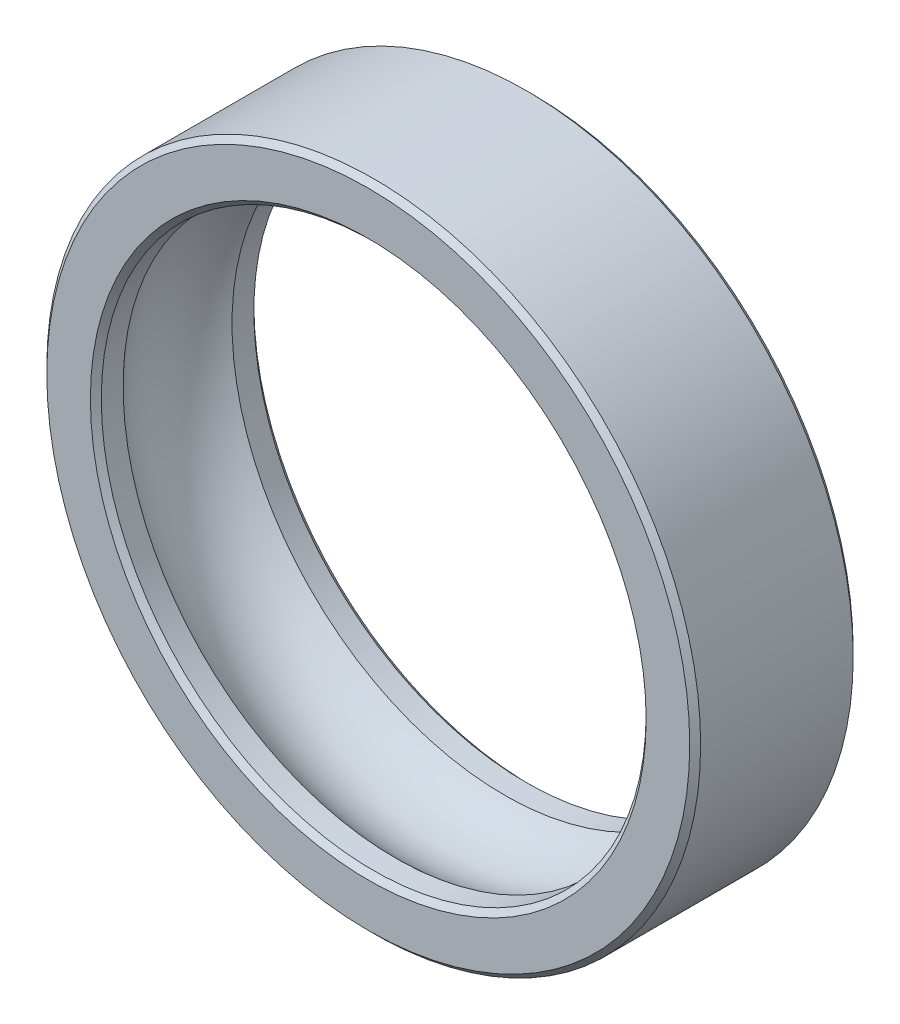
ISO-10303-21;
HEADER;
FILE_DESCRIPTION(('STEP AP214'),'2;1');
FILE_NAME('part.step','',(''),(''),'','','');
FILE_SCHEMA(('AUTOMOTIVE_DESIGN { 1 0 10303 214 1 1 1 1 }'));
ENDSEC;
DATA;
#1=APPLICATION_CONTEXT('core data for automotive mechanical design processes');
#2=APPLICATION_PROTOCOL_DEFINITION('international standard','automotive_design',2000,#1);
#3=PRODUCT_CONTEXT('',#1,'mechanical');
#4=PRODUCT('Part','Part','',(#3));
#5=PRODUCT_RELATED_PRODUCT_CATEGORY('part','',(#4));
#6=PRODUCT_DEFINITION_FORMATION('','',#4);
#7=PRODUCT_DEFINITION_CONTEXT('part definition',#1,'design');
#8=PRODUCT_DEFINITION('design','',#6,#7);
#9=PRODUCT_DEFINITION_SHAPE('','',#8);
#10=(LENGTH_UNIT() NAMED_UNIT(*) SI_UNIT(.MILLI.,.METRE.));
#11=(NAMED_UNIT(*) PLANE_ANGLE_UNIT() SI_UNIT($,.RADIAN.));
#12=(NAMED_UNIT(*) SI_UNIT($,.STERADIAN.) SOLID_ANGLE_UNIT());
#13=UNCERTAINTY_MEASURE_WITH_UNIT(LENGTH_MEASURE(1.E-05),#10,'distance_accuracy_value','');
#14=(GEOMETRIC_REPRESENTATION_CONTEXT(3) GLOBAL_UNCERTAINTY_ASSIGNED_CONTEXT((#13)) GLOBAL_UNIT_ASSIGNED_CONTEXT((#10,
#11,#12)) REPRESENTATION_CONTEXT('',''));
#15=CARTESIAN_POINT('',(0.,0.,0.));
#16=DIRECTION('',(0.,0.,1.));
#17=DIRECTION('',(1.,0.,0.));
#18=AXIS2_PLACEMENT_3D('',#15,#16,#17);
#19=CARTESIAN_POINT('',(0.,0.,0.));
#20=DIRECTION('',(0.,0.,1.));
#21=DIRECTION('',(1.,0.,0.));
#22=AXIS2_PLACEMENT_3D('',#19,#20,#21);
#23=CYLINDRICAL_SURFACE('',#22,1270.);
#24=CARTESIAN_POINT('',(0.,0.,-355.600000000001));
#25=DIRECTION('',(0.,0.,1.));
#26=DIRECTION('',(1.,0.,0.));
#27=AXIS2_PLACEMENT_3D('',#24,#25,#26);
#28=CIRCLE('',#27,1270.);
#29=CARTESIAN_POINT('',(1270.,0.,-355.600000000001));
#30=VERTEX_POINT('',#29);
#31=EDGE_CURVE('E48',#30,#30,#28,.F.);
#32=ORIENTED_EDGE('',*,*,#31,.T.);
#33=EDGE_LOOP('',(#32));
#34=FACE_BOUND('',#33,.T.);
#35=CARTESIAN_POINT('',(0.,0.,-254.));
#36=DIRECTION('',(0.,0.,1.));
#37=DIRECTION('',(1.,0.,0.));
#38=AXIS2_PLACEMENT_3D('',#35,#36,#37);
#39=CIRCLE('',#38,1270.);
#40=CARTESIAN_POINT('',(1270.,0.,-254.));
#41=VERTEX_POINT('',#40);
#42=EDGE_CURVE('E69',#41,#41,#39,.T.);
#43=ORIENTED_EDGE('',*,*,#42,.T.);
#44=EDGE_LOOP('',(#43));
#45=FACE_BOUND('',#44,.T.);
#46=ADVANCED_FACE('F37',(#34,#45),#23,.F.);
#47=CARTESIAN_POINT('',(0.,0.,0.));
#48=DIRECTION('',(0.,0.,1.));
#49=DIRECTION('',(1.,0.,0.));
#50=AXIS2_PLACEMENT_3D('',#47,#48,#49);
#51=TOROIDAL_SURFACE('',#50,1016.,359.210244842767);
#52=ORIENTED_EDGE('',*,*,#42,.F.);
#53=EDGE_LOOP('',(#52));
#54=FACE_BOUND('',#53,.T.);
#55=CARTESIAN_POINT('',(0.,0.,254.));
#56=DIRECTION('',(0.,0.,1.));
#57=DIRECTION('',(1.,0.,0.));
#58=AXIS2_PLACEMENT_3D('',#55,#56,#57);
#59=CIRCLE('',#58,1270.);
#60=CARTESIAN_POINT('',(1270.,0.,254.));
#61=VERTEX_POINT('',#60);
#62=EDGE_CURVE('E72',#61,#61,#59,.T.);
#63=ORIENTED_EDGE('',*,*,#62,.T.);
#64=EDGE_LOOP('',(#63));
#65=FACE_BOUND('',#64,.T.);
#66=ADVANCED_FACE('F76',(#54,#65),#51,.F.);
#67=CARTESIAN_POINT('',(0.,0.,0.));
#68=DIRECTION('',(0.,0.,1.));
#69=DIRECTION('',(1.,0.,0.));
#70=AXIS2_PLACEMENT_3D('',#67,#68,#69);
#71=CYLINDRICAL_SURFACE('',#70,1270.);
#72=CARTESIAN_POINT('',(0.,0.,355.6));
#73=DIRECTION('',(0.,0.,-1.));
#74=DIRECTION('',(-1.,0.,0.));
#75=AXIS2_PLACEMENT_3D('',#72,#73,#74);
#76=CIRCLE('',#75,1270.);
#77=CARTESIAN_POINT('',(-1270.,0.,355.6));
#78=VERTEX_POINT('',#77);
#79=EDGE_CURVE('E66',#78,#78,#76,.F.);
#80=ORIENTED_EDGE('',*,*,#79,.T.);
#81=EDGE_LOOP('',(#80));
#82=FACE_BOUND('',#81,.T.);
#83=ORIENTED_EDGE('',*,*,#62,.F.);
#84=EDGE_LOOP('',(#83));
#85=FACE_BOUND('',#84,.T.);
#86=ADVANCED_FACE('F78',(#82,#85),#71,.F.);
#87=CARTESIAN_POINT('',(0.,1524.,381.));
#88=DIRECTION('',(0.,0.,-1.));
#89=DIRECTION('',(-1.,0.,0.));
#90=AXIS2_PLACEMENT_3D('',#87,#88,#89);
#91=PLANE('',#90);
#92=CARTESIAN_POINT('',(0.,0.,381.));
#93=DIRECTION('',(0.,0.,-1.));
#94=DIRECTION('',(-1.,0.,0.));
#95=AXIS2_PLACEMENT_3D('',#92,#93,#94);
#96=CIRCLE('',#95,1295.4);
#97=CARTESIAN_POINT('',(-1295.4,0.,381.));
#98=VERTEX_POINT('',#97);
#99=EDGE_CURVE('E60',#98,#98,#96,.T.);
#100=ORIENTED_EDGE('',*,*,#99,.T.);
#101=EDGE_LOOP('',(#100));
#102=FACE_BOUND('',#101,.T.);
#103=CARTESIAN_POINT('',(0.,0.,381.));
#104=DIRECTION('',(0.,0.,-1.));
#105=DIRECTION('',(-1.,0.,0.));
#106=AXIS2_PLACEMENT_3D('',#103,#104,#105);
#107=CIRCLE('',#106,1498.6);
#108=CARTESIAN_POINT('',(-1498.6,0.,381.));
#109=VERTEX_POINT('',#108);
#110=EDGE_CURVE('E63',#109,#109,#107,.F.);
#111=ORIENTED_EDGE('',*,*,#110,.T.);
#112=EDGE_LOOP('',(#111));
#113=FACE_BOUND('',#112,.T.);
#114=ADVANCED_FACE('F80',(#102,#113),#91,.F.);
#115=CARTESIAN_POINT('',(0.,0.,0.));
#116=DIRECTION('',(0.,0.,1.));
#117=DIRECTION('',(1.,0.,0.));
#118=AXIS2_PLACEMENT_3D('',#115,#116,#117);
#119=CYLINDRICAL_SURFACE('',#118,1524.);
#120=CARTESIAN_POINT('',(0.,0.,355.6));
#121=DIRECTION('',(0.,0.,-1.));
#122=DIRECTION('',(-1.,0.,0.));
#123=AXIS2_PLACEMENT_3D('',#120,#121,#122);
#124=CIRCLE('',#123,1524.);
#125=CARTESIAN_POINT('',(-1524.,0.,355.6));
#126=VERTEX_POINT('',#125);
#127=EDGE_CURVE('E10',#126,#126,#124,.T.);
#128=ORIENTED_EDGE('',*,*,#127,.T.);
#129=EDGE_LOOP('',(#128));
#130=FACE_BOUND('',#129,.T.);
#131=CARTESIAN_POINT('',(0.,0.,-355.6));
#132=DIRECTION('',(0.,0.,1.));
#133=DIRECTION('',(1.,0.,0.));
#134=AXIS2_PLACEMENT_3D('',#131,#132,#133);
#135=CIRCLE('',#134,1524.);
#136=CARTESIAN_POINT('',(1524.,0.,-355.6));
#137=VERTEX_POINT('',#136);
#138=EDGE_CURVE('E44',#137,#137,#135,.T.);
#139=ORIENTED_EDGE('',*,*,#138,.T.);
#140=EDGE_LOOP('',(#139));
#141=FACE_BOUND('',#140,.T.);
#142=ADVANCED_FACE('F87',(#130,#141),#119,.T.);
#143=CARTESIAN_POINT('',(0.,1524.,-381.));
#144=DIRECTION('',(0.,0.,1.));
#145=DIRECTION('',(1.,0.,0.));
#146=AXIS2_PLACEMENT_3D('',#143,#144,#145);
#147=PLANE('',#146);
#148=CARTESIAN_POINT('',(0.,0.,-381.));
#149=DIRECTION('',(0.,0.,1.));
#150=DIRECTION('',(1.,0.,0.));
#151=AXIS2_PLACEMENT_3D('',#148,#149,#150);
#152=CIRCLE('',#151,1295.4);
#153=CARTESIAN_POINT('',(1295.4,0.,-381.));
#154=VERTEX_POINT('',#153);
#155=EDGE_CURVE('E52',#154,#154,#152,.T.);
#156=ORIENTED_EDGE('',*,*,#155,.T.);
#157=EDGE_LOOP('',(#156));
#158=FACE_BOUND('',#157,.T.);
#159=CARTESIAN_POINT('',(0.,0.,-381.));
#160=DIRECTION('',(0.,0.,1.));
#161=DIRECTION('',(1.,0.,0.));
#162=AXIS2_PLACEMENT_3D('',#159,#160,#161);
#163=CIRCLE('',#162,1498.6);
#164=CARTESIAN_POINT('',(1498.6,0.,-381.));
#165=VERTEX_POINT('',#164);
#166=EDGE_CURVE('E57',#165,#165,#163,.F.);
#167=ORIENTED_EDGE('',*,*,#166,.T.);
#168=EDGE_LOOP('',(#167));
#169=FACE_BOUND('',#168,.T.);
#170=ADVANCED_FACE('F103',(#158,#169),#147,.F.);
#171=CARTESIAN_POINT('',(0.,0.,355.6));
#172=DIRECTION('',(0.,0.,1.));
#173=DIRECTION('',(1.,0.,0.));
#174=AXIS2_PLACEMENT_3D('',#171,#172,#173);
#175=CONICAL_SURFACE('',#174,1270.,0.785398163397448);
#176=ORIENTED_EDGE('',*,*,#99,.F.);
#177=EDGE_LOOP('',(#176));
#178=FACE_BOUND('',#177,.T.);
#179=ORIENTED_EDGE('',*,*,#79,.F.);
#180=EDGE_LOOP('',(#179));
#181=FACE_BOUND('',#180,.T.);
#182=ADVANCED_FACE('F99',(#178,#181),#175,.F.);
#183=CARTESIAN_POINT('',(0.,0.,-381.));
#184=DIRECTION('',(0.,0.,-1.));
#185=DIRECTION('',(-1.,0.,0.));
#186=AXIS2_PLACEMENT_3D('',#183,#184,#185);
#187=CONICAL_SURFACE('',#186,1295.4,0.785398163397457);
#188=ORIENTED_EDGE('',*,*,#31,.F.);
#189=EDGE_LOOP('',(#188));
#190=FACE_BOUND('',#189,.T.);
#191=ORIENTED_EDGE('',*,*,#155,.F.);
#192=EDGE_LOOP('',(#191));
#193=FACE_BOUND('',#192,.T.);
#194=ADVANCED_FACE('F102',(#190,#193),#187,.F.);
#195=CARTESIAN_POINT('',(0.,0.,381.));
#196=DIRECTION('',(0.,0.,-1.));
#197=DIRECTION('',(-1.,0.,0.));
#198=AXIS2_PLACEMENT_3D('',#195,#196,#197);
#199=CONICAL_SURFACE('',#198,1498.6,0.785398163397457);
#200=ORIENTED_EDGE('',*,*,#127,.F.);
#201=EDGE_LOOP('',(#200));
#202=FACE_BOUND('',#201,.T.);
#203=ORIENTED_EDGE('',*,*,#110,.F.);
#204=EDGE_LOOP('',(#203));
#205=FACE_BOUND('',#204,.T.);
#206=ADVANCED_FACE('F106',(#202,#205),#199,.T.);
#207=CARTESIAN_POINT('',(0.,0.,-355.6));
#208=DIRECTION('',(0.,0.,1.));
#209=DIRECTION('',(1.,0.,0.));
#210=AXIS2_PLACEMENT_3D('',#207,#208,#209);
#211=CONICAL_SURFACE('',#210,1524.,0.785398163397453);
#212=ORIENTED_EDGE('',*,*,#166,.F.);
#213=EDGE_LOOP('',(#212));
#214=FACE_BOUND('',#213,.T.);
#215=ORIENTED_EDGE('',*,*,#138,.F.);
#216=EDGE_LOOP('',(#215));
#217=FACE_BOUND('',#216,.T.);
#218=ADVANCED_FACE('F39',(#214,#217),#211,.T.);
#219=CLOSED_SHELL('',(#46,#66,#86,#114,#142,#170,#182,#194,#206,#218));
#220=MANIFOLD_SOLID_BREP('B2',#219);
#221=ADVANCED_BREP_SHAPE_REPRESENTATION('',(#18,#220),#14);
#222=SHAPE_DEFINITION_REPRESENTATION(#9,#221);
ENDSEC;
END-ISO-10303-21;
